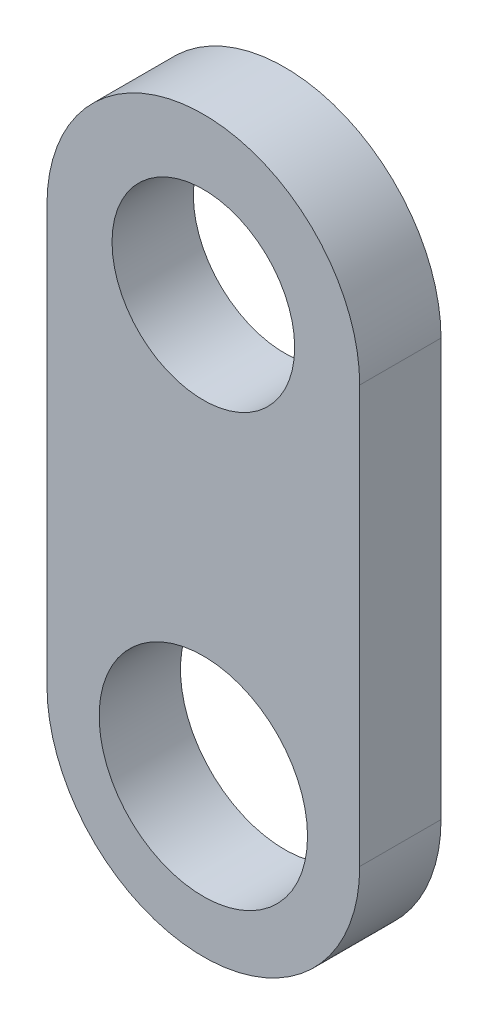
ISO-10303-21;
HEADER;
FILE_DESCRIPTION(('STEP AP214'),'2;1');
FILE_NAME('part.step','',(''),(''),'','','');
FILE_SCHEMA(('AUTOMOTIVE_DESIGN { 1 0 10303 214 1 1 1 1 }'));
ENDSEC;
DATA;
#1=APPLICATION_CONTEXT('core data for automotive mechanical design processes');
#2=APPLICATION_PROTOCOL_DEFINITION('international standard','automotive_design',2000,#1);
#3=PRODUCT_CONTEXT('',#1,'mechanical');
#4=PRODUCT('Part','Part','',(#3));
#5=PRODUCT_RELATED_PRODUCT_CATEGORY('part','',(#4));
#6=PRODUCT_DEFINITION_FORMATION('','',#4);
#7=PRODUCT_DEFINITION_CONTEXT('part definition',#1,'design');
#8=PRODUCT_DEFINITION('design','',#6,#7);
#9=PRODUCT_DEFINITION_SHAPE('','',#8);
#10=(LENGTH_UNIT() NAMED_UNIT(*) SI_UNIT(.MILLI.,.METRE.));
#11=(NAMED_UNIT(*) PLANE_ANGLE_UNIT() SI_UNIT($,.RADIAN.));
#12=(NAMED_UNIT(*) SI_UNIT($,.STERADIAN.) SOLID_ANGLE_UNIT());
#13=UNCERTAINTY_MEASURE_WITH_UNIT(LENGTH_MEASURE(1.E-05),#10,'distance_accuracy_value','');
#14=(GEOMETRIC_REPRESENTATION_CONTEXT(3) GLOBAL_UNCERTAINTY_ASSIGNED_CONTEXT((#13)) GLOBAL_UNIT_ASSIGNED_CONTEXT((#10,
#11,#12)) REPRESENTATION_CONTEXT('',''));
#15=CARTESIAN_POINT('',(0.,0.,0.));
#16=DIRECTION('',(0.,0.,1.));
#17=DIRECTION('',(1.,0.,0.));
#18=AXIS2_PLACEMENT_3D('',#15,#16,#17);
#19=CARTESIAN_POINT('',(0.,0.,4.953));
#20=DIRECTION('',(0.,0.,1.));
#21=DIRECTION('',(1.,0.,0.));
#22=AXIS2_PLACEMENT_3D('',#19,#20,#21);
#23=PLANE('',#22);
#24=CARTESIAN_POINT('',(0.,50.8,4.953));
#25=DIRECTION('',(0.,0.,1.));
#26=DIRECTION('',(1.,0.,0.));
#27=AXIS2_PLACEMENT_3D('',#24,#25,#26);
#28=CIRCLE('',#27,11.1252);
#29=CARTESIAN_POINT('',(11.1252,50.8,4.953));
#30=VERTEX_POINT('',#29);
#31=EDGE_CURVE('E121',#30,#30,#28,.T.);
#32=ORIENTED_EDGE('',*,*,#31,.F.);
#33=EDGE_LOOP('',(#32));
#34=FACE_BOUND('',#33,.T.);
#35=CARTESIAN_POINT('',(0.,0.,4.953));
#36=DIRECTION('',(0.,0.,1.));
#37=DIRECTION('',(1.,0.,0.));
#38=AXIS2_PLACEMENT_3D('',#35,#36,#37);
#39=CIRCLE('',#38,19.05);
#40=CARTESIAN_POINT('',(-19.05,0.,4.953));
#41=VERTEX_POINT('',#40);
#42=CARTESIAN_POINT('',(19.05,0.,4.953));
#43=VERTEX_POINT('',#42);
#44=EDGE_CURVE('E105',#41,#43,#39,.T.);
#45=ORIENTED_EDGE('',*,*,#44,.T.);
#46=DIRECTION('',(0.,1.,0.));
#47=VECTOR('',#46,1.);
#48=CARTESIAN_POINT('',(19.05,0.,4.953));
#49=LINE('',#48,#47);
#50=CARTESIAN_POINT('',(19.05,50.8,4.953));
#51=VERTEX_POINT('',#50);
#52=EDGE_CURVE('E100',#43,#51,#49,.T.);
#53=ORIENTED_EDGE('',*,*,#52,.T.);
#54=CARTESIAN_POINT('',(0.,50.8,4.953));
#55=DIRECTION('',(0.,0.,1.));
#56=DIRECTION('',(1.,0.,0.));
#57=AXIS2_PLACEMENT_3D('',#54,#55,#56);
#58=CIRCLE('',#57,19.05);
#59=CARTESIAN_POINT('',(-19.05,50.8,4.953));
#60=VERTEX_POINT('',#59);
#61=EDGE_CURVE('E99',#51,#60,#58,.T.);
#62=ORIENTED_EDGE('',*,*,#61,.T.);
#63=DIRECTION('',(0.,-1.,0.));
#64=VECTOR('',#63,1.);
#65=CARTESIAN_POINT('',(-19.05,0.,4.953));
#66=LINE('',#65,#64);
#67=EDGE_CURVE('E66',#60,#41,#66,.T.);
#68=ORIENTED_EDGE('',*,*,#67,.T.);
#69=EDGE_LOOP('',(#45,#53,#62,#68));
#70=FACE_BOUND('',#69,.T.);
#71=CARTESIAN_POINT('',(0.,0.,4.953));
#72=DIRECTION('',(0.,0.,1.));
#73=DIRECTION('',(1.,0.,0.));
#74=AXIS2_PLACEMENT_3D('',#71,#72,#73);
#75=CIRCLE('',#74,12.69365);
#76=CARTESIAN_POINT('',(12.69365,0.,4.953));
#77=VERTEX_POINT('',#76);
#78=EDGE_CURVE('E145',#77,#77,#75,.T.);
#79=ORIENTED_EDGE('',*,*,#78,.F.);
#80=EDGE_LOOP('',(#79));
#81=FACE_BOUND('',#80,.T.);
#82=ADVANCED_FACE('F47',(#34,#70,#81),#23,.T.);
#83=CARTESIAN_POINT('',(0.,0.,-4.953));
#84=DIRECTION('',(0.,0.,1.));
#85=DIRECTION('',(1.,0.,0.));
#86=AXIS2_PLACEMENT_3D('',#83,#84,#85);
#87=PLANE('',#86);
#88=CARTESIAN_POINT('',(0.,0.,-4.953));
#89=DIRECTION('',(0.,0.,1.));
#90=DIRECTION('',(1.,0.,0.));
#91=AXIS2_PLACEMENT_3D('',#88,#89,#90);
#92=CIRCLE('',#91,19.05);
#93=CARTESIAN_POINT('',(-19.05,0.,-4.953));
#94=VERTEX_POINT('',#93);
#95=CARTESIAN_POINT('',(19.05,0.,-4.953));
#96=VERTEX_POINT('',#95);
#97=EDGE_CURVE('E117',#94,#96,#92,.T.);
#98=ORIENTED_EDGE('',*,*,#97,.F.);
#99=DIRECTION('',(0.,-1.,0.));
#100=VECTOR('',#99,1.);
#101=CARTESIAN_POINT('',(-19.05,0.,-4.953));
#102=LINE('',#101,#100);
#103=CARTESIAN_POINT('',(-19.05,50.8,-4.953));
#104=VERTEX_POINT('',#103);
#105=EDGE_CURVE('E89',#104,#94,#102,.T.);
#106=ORIENTED_EDGE('',*,*,#105,.F.);
#107=CARTESIAN_POINT('',(0.,50.8,-4.953));
#108=DIRECTION('',(0.,0.,1.));
#109=DIRECTION('',(1.,0.,0.));
#110=AXIS2_PLACEMENT_3D('',#107,#108,#109);
#111=CIRCLE('',#110,19.05);
#112=CARTESIAN_POINT('',(19.05,50.8,-4.953));
#113=VERTEX_POINT('',#112);
#114=EDGE_CURVE('E83',#113,#104,#111,.T.);
#115=ORIENTED_EDGE('',*,*,#114,.F.);
#116=DIRECTION('',(0.,1.,0.));
#117=VECTOR('',#116,1.);
#118=CARTESIAN_POINT('',(19.05,0.,-4.953));
#119=LINE('',#118,#117);
#120=EDGE_CURVE('E106',#96,#113,#119,.T.);
#121=ORIENTED_EDGE('',*,*,#120,.F.);
#122=EDGE_LOOP('',(#98,#106,#115,#121));
#123=FACE_BOUND('',#122,.T.);
#124=CARTESIAN_POINT('',(0.,50.8,-4.953));
#125=DIRECTION('',(0.,0.,1.));
#126=DIRECTION('',(1.,0.,0.));
#127=AXIS2_PLACEMENT_3D('',#124,#125,#126);
#128=CIRCLE('',#127,11.1252);
#129=CARTESIAN_POINT('',(11.1252,50.8,-4.953));
#130=VERTEX_POINT('',#129);
#131=EDGE_CURVE('E137',#130,#130,#128,.T.);
#132=ORIENTED_EDGE('',*,*,#131,.T.);
#133=EDGE_LOOP('',(#132));
#134=FACE_BOUND('',#133,.T.);
#135=CARTESIAN_POINT('',(0.,0.,-4.953));
#136=DIRECTION('',(0.,0.,1.));
#137=DIRECTION('',(1.,0.,0.));
#138=AXIS2_PLACEMENT_3D('',#135,#136,#137);
#139=CIRCLE('',#138,12.69365);
#140=CARTESIAN_POINT('',(12.69365,0.,-4.953));
#141=VERTEX_POINT('',#140);
#142=EDGE_CURVE('E146',#141,#141,#139,.T.);
#143=ORIENTED_EDGE('',*,*,#142,.T.);
#144=EDGE_LOOP('',(#143));
#145=FACE_BOUND('',#144,.T.);
#146=ADVANCED_FACE('F134',(#123,#134,#145),#87,.F.);
#147=CARTESIAN_POINT('',(0.,0.,4.953));
#148=DIRECTION('',(0.,0.,-1.));
#149=DIRECTION('',(-1.,0.,0.));
#150=AXIS2_PLACEMENT_3D('',#147,#148,#149);
#151=CYLINDRICAL_SURFACE('',#150,19.05);
#152=ORIENTED_EDGE('',*,*,#97,.T.);
#153=DIRECTION('',(0.,0.,-1.));
#154=VECTOR('',#153,1.);
#155=CARTESIAN_POINT('',(19.05,0.,4.953));
#156=LINE('',#155,#154);
#157=EDGE_CURVE('E12',#43,#96,#156,.T.);
#158=ORIENTED_EDGE('',*,*,#157,.F.);
#159=ORIENTED_EDGE('',*,*,#44,.F.);
#160=DIRECTION('',(0.,0.,-1.));
#161=VECTOR('',#160,1.);
#162=CARTESIAN_POINT('',(-19.05,0.,4.953));
#163=LINE('',#162,#161);
#164=EDGE_CURVE('E114',#41,#94,#163,.T.);
#165=ORIENTED_EDGE('',*,*,#164,.T.);
#166=EDGE_LOOP('',(#152,#158,#159,#165));
#167=FACE_BOUND('',#166,.T.);
#168=ADVANCED_FACE('F51',(#167),#151,.T.);
#169=CARTESIAN_POINT('',(19.05,0.,4.953));
#170=DIRECTION('',(-1.,0.,0.));
#171=DIRECTION('',(0.,0.,1.));
#172=AXIS2_PLACEMENT_3D('',#169,#170,#171);
#173=PLANE('',#172);
#174=ORIENTED_EDGE('',*,*,#120,.T.);
#175=DIRECTION('',(0.,0.,-1.));
#176=VECTOR('',#175,1.);
#177=CARTESIAN_POINT('',(19.05,50.8,4.953));
#178=LINE('',#177,#176);
#179=EDGE_CURVE('E56',#51,#113,#178,.T.);
#180=ORIENTED_EDGE('',*,*,#179,.F.);
#181=ORIENTED_EDGE('',*,*,#52,.F.);
#182=ORIENTED_EDGE('',*,*,#157,.T.);
#183=EDGE_LOOP('',(#174,#180,#181,#182));
#184=FACE_BOUND('',#183,.T.);
#185=ADVANCED_FACE('F104',(#184),#173,.F.);
#186=CARTESIAN_POINT('',(0.,50.8,4.953));
#187=DIRECTION('',(0.,0.,-1.));
#188=DIRECTION('',(-1.,0.,0.));
#189=AXIS2_PLACEMENT_3D('',#186,#187,#188);
#190=CYLINDRICAL_SURFACE('',#189,19.05);
#191=ORIENTED_EDGE('',*,*,#114,.T.);
#192=DIRECTION('',(0.,0.,-1.));
#193=VECTOR('',#192,1.);
#194=CARTESIAN_POINT('',(-19.05,50.8,4.953));
#195=LINE('',#194,#193);
#196=EDGE_CURVE('E107',#60,#104,#195,.T.);
#197=ORIENTED_EDGE('',*,*,#196,.F.);
#198=ORIENTED_EDGE('',*,*,#61,.F.);
#199=ORIENTED_EDGE('',*,*,#179,.T.);
#200=EDGE_LOOP('',(#191,#197,#198,#199));
#201=FACE_BOUND('',#200,.T.);
#202=ADVANCED_FACE('F108',(#201),#190,.T.);
#203=CARTESIAN_POINT('',(-19.05,0.,4.953));
#204=DIRECTION('',(1.,0.,0.));
#205=DIRECTION('',(0.,0.,-1.));
#206=AXIS2_PLACEMENT_3D('',#203,#204,#205);
#207=PLANE('',#206);
#208=ORIENTED_EDGE('',*,*,#105,.T.);
#209=ORIENTED_EDGE('',*,*,#164,.F.);
#210=ORIENTED_EDGE('',*,*,#67,.F.);
#211=ORIENTED_EDGE('',*,*,#196,.T.);
#212=EDGE_LOOP('',(#208,#209,#210,#211));
#213=FACE_BOUND('',#212,.T.);
#214=ADVANCED_FACE('F135',(#213),#207,.F.);
#215=CARTESIAN_POINT('',(0.,50.8,4.953));
#216=DIRECTION('',(0.,0.,-1.));
#217=DIRECTION('',(-1.,0.,0.));
#218=AXIS2_PLACEMENT_3D('',#215,#216,#217);
#219=CYLINDRICAL_SURFACE('',#218,11.1252);
#220=ORIENTED_EDGE('',*,*,#31,.T.);
#221=EDGE_LOOP('',(#220));
#222=FACE_BOUND('',#221,.T.);
#223=ORIENTED_EDGE('',*,*,#131,.F.);
#224=EDGE_LOOP('',(#223));
#225=FACE_BOUND('',#224,.T.);
#226=ADVANCED_FACE('F170',(#222,#225),#219,.F.);
#227=CARTESIAN_POINT('',(0.,0.,4.953));
#228=DIRECTION('',(0.,0.,-1.));
#229=DIRECTION('',(-1.,0.,0.));
#230=AXIS2_PLACEMENT_3D('',#227,#228,#229);
#231=CYLINDRICAL_SURFACE('',#230,12.69365);
#232=ORIENTED_EDGE('',*,*,#78,.T.);
#233=EDGE_LOOP('',(#232));
#234=FACE_BOUND('',#233,.T.);
#235=ORIENTED_EDGE('',*,*,#142,.F.);
#236=EDGE_LOOP('',(#235));
#237=FACE_BOUND('',#236,.T.);
#238=ADVANCED_FACE('F156',(#234,#237),#231,.F.);
#239=CLOSED_SHELL('',(#82,#146,#168,#185,#202,#214,#226,#238));
#240=MANIFOLD_SOLID_BREP('B2',#239);
#241=ADVANCED_BREP_SHAPE_REPRESENTATION('',(#18,#240),#14);
#242=SHAPE_DEFINITION_REPRESENTATION(#9,#241);
ENDSEC;
END-ISO-10303-21;
